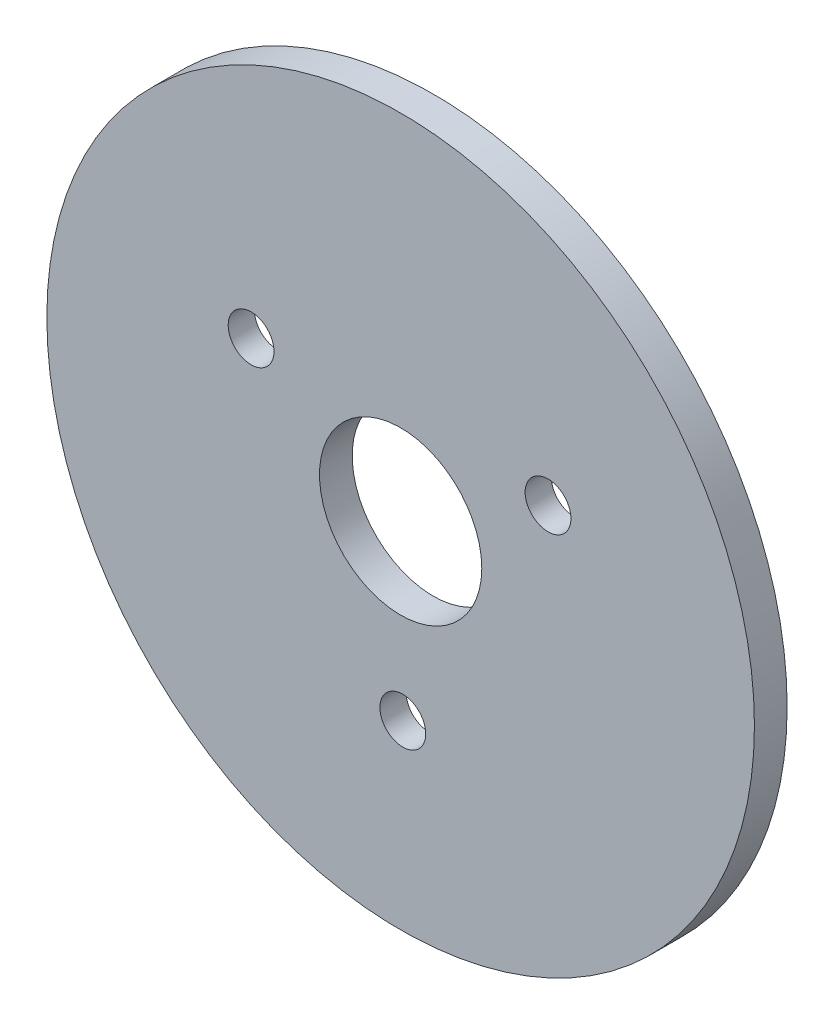
ISO-10303-21;
HEADER;
FILE_DESCRIPTION(('STEP AP214'),'2;1');
FILE_NAME('part.step','',(''),(''),'','','');
FILE_SCHEMA(('AUTOMOTIVE_DESIGN { 1 0 10303 214 1 1 1 1 }'));
ENDSEC;
DATA;
#1=APPLICATION_CONTEXT('core data for automotive mechanical design processes');
#2=APPLICATION_PROTOCOL_DEFINITION('international standard','automotive_design',2000,#1);
#3=PRODUCT_CONTEXT('',#1,'mechanical');
#4=PRODUCT('Part','Part','',(#3));
#5=PRODUCT_RELATED_PRODUCT_CATEGORY('part','',(#4));
#6=PRODUCT_DEFINITION_FORMATION('','',#4);
#7=PRODUCT_DEFINITION_CONTEXT('part definition',#1,'design');
#8=PRODUCT_DEFINITION('design','',#6,#7);
#9=PRODUCT_DEFINITION_SHAPE('','',#8);
#10=(LENGTH_UNIT() NAMED_UNIT(*) SI_UNIT(.MILLI.,.METRE.));
#11=(NAMED_UNIT(*) PLANE_ANGLE_UNIT() SI_UNIT($,.RADIAN.));
#12=(NAMED_UNIT(*) SI_UNIT($,.STERADIAN.) SOLID_ANGLE_UNIT());
#13=UNCERTAINTY_MEASURE_WITH_UNIT(LENGTH_MEASURE(1.E-05),#10,'distance_accuracy_value','');
#14=(GEOMETRIC_REPRESENTATION_CONTEXT(3) GLOBAL_UNCERTAINTY_ASSIGNED_CONTEXT((#13)) GLOBAL_UNIT_ASSIGNED_CONTEXT((#10,
#11,#12)) REPRESENTATION_CONTEXT('',''));
#15=CARTESIAN_POINT('',(0.,0.,0.));
#16=DIRECTION('',(0.,0.,1.));
#17=DIRECTION('',(1.,0.,0.));
#18=AXIS2_PLACEMENT_3D('',#15,#16,#17);
#19=CARTESIAN_POINT('',(11.2604799051485,6.69280128752395,-14.75));
#20=DIRECTION('',(0.,0.,-1.));
#21=DIRECTION('',(-1.,0.,0.));
#22=AXIS2_PLACEMENT_3D('',#19,#20,#21);
#23=CYLINDRICAL_SURFACE('',#22,1.75);
#24=CARTESIAN_POINT('',(11.2604799051485,6.69280128752395,-14.75));
#25=DIRECTION('',(0.,0.,-1.));
#26=DIRECTION('',(-1.,0.,0.));
#27=AXIS2_PLACEMENT_3D('',#24,#25,#26);
#28=CIRCLE('',#27,1.75);
#29=CARTESIAN_POINT('',(9.51047990514846,6.69280128752395,-14.75));
#30=VERTEX_POINT('',#29);
#31=EDGE_CURVE('E64',#30,#30,#28,.T.);
#32=ORIENTED_EDGE('',*,*,#31,.F.);
#33=EDGE_LOOP('',(#32));
#34=FACE_BOUND('',#33,.T.);
#35=CARTESIAN_POINT('',(11.2604799051485,6.69280128752395,-16.75));
#36=DIRECTION('',(0.,0.,-1.));
#37=DIRECTION('',(-1.,0.,0.));
#38=AXIS2_PLACEMENT_3D('',#35,#36,#37);
#39=CIRCLE('',#38,1.75);
#40=CARTESIAN_POINT('',(9.51047990514846,6.69280128752395,-16.75));
#41=VERTEX_POINT('',#40);
#42=EDGE_CURVE('E83',#41,#41,#39,.T.);
#43=ORIENTED_EDGE('',*,*,#42,.T.);
#44=EDGE_LOOP('',(#43));
#45=FACE_BOUND('',#44,.T.);
#46=ADVANCED_FACE('F34',(#34,#45),#23,.F.);
#47=CARTESIAN_POINT('',(0.165895984902648,-13.0982623004247,-14.75));
#48=DIRECTION('',(0.,0.,-1.));
#49=DIRECTION('',(-1.,0.,0.));
#50=AXIS2_PLACEMENT_3D('',#47,#48,#49);
#51=CYLINDRICAL_SURFACE('',#50,1.75);
#52=CARTESIAN_POINT('',(0.165895984902648,-13.0982623004247,-14.75));
#53=DIRECTION('',(0.,0.,-1.));
#54=DIRECTION('',(-1.,0.,0.));
#55=AXIS2_PLACEMENT_3D('',#52,#53,#54);
#56=CIRCLE('',#55,1.75);
#57=CARTESIAN_POINT('',(-1.58410401509735,-13.0982623004247,-14.75));
#58=VERTEX_POINT('',#57);
#59=EDGE_CURVE('E67',#58,#58,#56,.T.);
#60=ORIENTED_EDGE('',*,*,#59,.F.);
#61=EDGE_LOOP('',(#60));
#62=FACE_BOUND('',#61,.T.);
#63=CARTESIAN_POINT('',(0.165895984902648,-13.0982623004247,-16.75));
#64=DIRECTION('',(0.,0.,-1.));
#65=DIRECTION('',(-1.,0.,0.));
#66=AXIS2_PLACEMENT_3D('',#63,#64,#65);
#67=CIRCLE('',#66,1.75);
#68=CARTESIAN_POINT('',(-1.58410401509735,-13.0982623004247,-16.75));
#69=VERTEX_POINT('',#68);
#70=EDGE_CURVE('E77',#69,#69,#67,.T.);
#71=ORIENTED_EDGE('',*,*,#70,.T.);
#72=EDGE_LOOP('',(#71));
#73=FACE_BOUND('',#72,.T.);
#74=ADVANCED_FACE('F109',(#62,#73),#51,.F.);
#75=CARTESIAN_POINT('',(-11.4263758900512,6.40546101290072,-14.75));
#76=DIRECTION('',(0.,0.,-1.));
#77=DIRECTION('',(-1.,0.,0.));
#78=AXIS2_PLACEMENT_3D('',#75,#76,#77);
#79=CYLINDRICAL_SURFACE('',#78,1.75);
#80=CARTESIAN_POINT('',(-11.4263758900512,6.40546101290072,-14.75));
#81=DIRECTION('',(0.,0.,-1.));
#82=DIRECTION('',(-1.,0.,0.));
#83=AXIS2_PLACEMENT_3D('',#80,#81,#82);
#84=CIRCLE('',#83,1.75);
#85=CARTESIAN_POINT('',(-13.1763758900512,6.40546101290072,-14.75));
#86=VERTEX_POINT('',#85);
#87=EDGE_CURVE('E63',#86,#86,#84,.T.);
#88=ORIENTED_EDGE('',*,*,#87,.F.);
#89=EDGE_LOOP('',(#88));
#90=FACE_BOUND('',#89,.T.);
#91=CARTESIAN_POINT('',(-11.4263758900512,6.40546101290072,-16.75));
#92=DIRECTION('',(0.,0.,-1.));
#93=DIRECTION('',(-1.,0.,0.));
#94=AXIS2_PLACEMENT_3D('',#91,#92,#93);
#95=CIRCLE('',#94,1.75);
#96=CARTESIAN_POINT('',(-13.1763758900512,6.40546101290072,-16.75));
#97=VERTEX_POINT('',#96);
#98=EDGE_CURVE('E76',#97,#97,#95,.T.);
#99=ORIENTED_EDGE('',*,*,#98,.T.);
#100=EDGE_LOOP('',(#99));
#101=FACE_BOUND('',#100,.T.);
#102=ADVANCED_FACE('F116',(#90,#101),#79,.F.);
#103=CARTESIAN_POINT('',(0.,0.,-7.25));
#104=DIRECTION('',(0.,0.,1.));
#105=DIRECTION('',(1.,0.,0.));
#106=AXIS2_PLACEMENT_3D('',#103,#104,#105);
#107=CYLINDRICAL_SURFACE('',#106,6.2);
#108=CARTESIAN_POINT('',(0.,0.,-17.25));
#109=DIRECTION('',(0.,0.,1.));
#110=DIRECTION('',(1.,0.,0.));
#111=AXIS2_PLACEMENT_3D('',#108,#109,#110);
#112=CIRCLE('',#111,6.2);
#113=CARTESIAN_POINT('',(6.2,0.,-17.25));
#114=VERTEX_POINT('',#113);
#115=EDGE_CURVE('E55',#114,#114,#112,.F.);
#116=CARTESIAN_POINT('',(0.,0.,-14.75));
#117=DIRECTION('',(0.,0.,1.));
#118=DIRECTION('',(1.,0.,0.));
#119=AXIS2_PLACEMENT_3D('',#116,#117,#118);
#120=CIRCLE('',#119,6.2);
#121=CARTESIAN_POINT('',(6.2,0.,-14.75));
#122=VERTEX_POINT('',#121);
#123=EDGE_CURVE('E60',#122,#122,#120,.F.);
#124=CARTESIAN_POINT('',(6.2,0.,-17.25));
#125=CARTESIAN_POINT('',(6.2,0.,-17.2239583333333));
#126=CARTESIAN_POINT('',(6.2,0.,-17.1979166666667));
#127=CARTESIAN_POINT('',(6.2,0.,-17.1458333333333));
#128=CARTESIAN_POINT('',(6.2,0.,-17.1197916666667));
#129=CARTESIAN_POINT('',(6.2,0.,-17.0677083333333));
#130=CARTESIAN_POINT('',(6.2,0.,-17.0416666666667));
#131=CARTESIAN_POINT('',(6.2,0.,-16.9895833333333));
#132=CARTESIAN_POINT('',(6.2,0.,-16.9635416666667));
#133=CARTESIAN_POINT('',(6.2,0.,-16.9114583333333));
#134=CARTESIAN_POINT('',(6.2,0.,-16.8854166666667));
#135=CARTESIAN_POINT('',(6.2,0.,-16.8333333333333));
#136=CARTESIAN_POINT('',(6.2,0.,-16.8072916666667));
#137=CARTESIAN_POINT('',(6.2,0.,-16.7552083333333));
#138=CARTESIAN_POINT('',(6.2,0.,-16.7291666666667));
#139=CARTESIAN_POINT('',(6.2,0.,-16.6770833333333));
#140=CARTESIAN_POINT('',(6.2,0.,-16.6510416666667));
#141=CARTESIAN_POINT('',(6.2,0.,-16.5989583333333));
#142=CARTESIAN_POINT('',(6.2,0.,-16.5729166666667));
#143=CARTESIAN_POINT('',(6.2,0.,-16.5208333333333));
#144=CARTESIAN_POINT('',(6.2,0.,-16.4947916666667));
#145=CARTESIAN_POINT('',(6.2,0.,-16.4427083333333));
#146=CARTESIAN_POINT('',(6.2,0.,-16.4166666666667));
#147=CARTESIAN_POINT('',(6.2,0.,-16.3645833333333));
#148=CARTESIAN_POINT('',(6.2,0.,-16.3385416666667));
#149=CARTESIAN_POINT('',(6.2,0.,-16.2864583333333));
#150=CARTESIAN_POINT('',(6.2,0.,-16.2604166666667));
#151=CARTESIAN_POINT('',(6.2,0.,-16.2083333333333));
#152=CARTESIAN_POINT('',(6.2,0.,-16.1822916666667));
#153=CARTESIAN_POINT('',(6.2,0.,-16.1302083333333));
#154=CARTESIAN_POINT('',(6.2,0.,-16.1041666666667));
#155=CARTESIAN_POINT('',(6.2,0.,-16.0520833333333));
#156=CARTESIAN_POINT('',(6.2,0.,-16.0260416666667));
#157=CARTESIAN_POINT('',(6.2,0.,-15.9739583333333));
#158=CARTESIAN_POINT('',(6.2,0.,-15.9479166666667));
#159=CARTESIAN_POINT('',(6.2,0.,-15.8958333333333));
#160=CARTESIAN_POINT('',(6.2,0.,-15.8697916666667));
#161=CARTESIAN_POINT('',(6.2,0.,-15.8177083333333));
#162=CARTESIAN_POINT('',(6.2,0.,-15.7916666666667));
#163=CARTESIAN_POINT('',(6.2,0.,-15.7395833333333));
#164=CARTESIAN_POINT('',(6.2,0.,-15.7135416666667));
#165=CARTESIAN_POINT('',(6.2,0.,-15.6614583333333));
#166=CARTESIAN_POINT('',(6.2,0.,-15.6354166666667));
#167=CARTESIAN_POINT('',(6.2,0.,-15.5833333333333));
#168=CARTESIAN_POINT('',(6.2,0.,-15.5572916666667));
#169=CARTESIAN_POINT('',(6.2,0.,-15.5052083333333));
#170=CARTESIAN_POINT('',(6.2,0.,-15.4791666666667));
#171=CARTESIAN_POINT('',(6.2,0.,-15.4270833333333));
#172=CARTESIAN_POINT('',(6.2,0.,-15.4010416666667));
#173=CARTESIAN_POINT('',(6.2,0.,-15.3489583333333));
#174=CARTESIAN_POINT('',(6.2,0.,-15.3229166666667));
#175=CARTESIAN_POINT('',(6.2,0.,-15.2708333333333));
#176=CARTESIAN_POINT('',(6.2,0.,-15.2447916666667));
#177=CARTESIAN_POINT('',(6.2,0.,-15.1927083333333));
#178=CARTESIAN_POINT('',(6.2,0.,-15.1666666666667));
#179=CARTESIAN_POINT('',(6.2,0.,-15.1145833333333));
#180=CARTESIAN_POINT('',(6.2,0.,-15.0885416666667));
#181=CARTESIAN_POINT('',(6.2,0.,-15.0364583333333));
#182=CARTESIAN_POINT('',(6.2,0.,-15.0104166666667));
#183=CARTESIAN_POINT('',(6.2,0.,-14.9583333333333));
#184=CARTESIAN_POINT('',(6.2,0.,-14.9322916666667));
#185=CARTESIAN_POINT('',(6.2,0.,-14.8802083333333));
#186=CARTESIAN_POINT('',(6.2,0.,-14.8541666666667));
#187=CARTESIAN_POINT('',(6.2,0.,-14.8020833333333));
#188=CARTESIAN_POINT('',(6.2,0.,-14.7760416666667));
#189=CARTESIAN_POINT('',(6.2,0.,-14.75));
#190=B_SPLINE_CURVE_WITH_KNOTS('',3,(#124,#125,#126,#127,#128,#129,#130,#131,#132,#133,#134,
#135,#136,#137,#138,#139,#140,#141,#142,#143,#144,#145,#146,#147,#148,#149,#150,#151,#152,#153,
#154,#155,#156,#157,#158,#159,#160,#161,#162,#163,#164,#165,#166,#167,#168,#169,#170,#171,#172,
#173,#174,#175,#176,#177,#178,#179,#180,#181,#182,#183,#184,#185,#186,#187,#188,#189),
.UNSPECIFIED.,.F.,.F.,(4,2,2,2,2,2,2,2,2,2,2,2,2,2,2,2,2,2,2,2,2,2,2,2,2,2,2,2,2,2,2,2,4),(0.,
0.0781250000000018,0.15625,0.234375000000002,0.3125,0.390625000000002,0.46875,0.546875000000002,
0.625000000000001,0.703125000000002,0.781250000000001,0.859375000000002,0.937500000000001,
1.015625,1.09375,1.171875,1.25,1.328125,1.40625,1.484375,1.5625,1.640625,1.71875,1.796875,1.875,
1.953125,2.03125,2.109375,2.1875,2.265625,2.34375,2.421875,2.5),.UNSPECIFIED.);
#191=EDGE_CURVE('BSEAM130',#114,#122,#190,.T.);
#192=ORIENTED_EDGE('',*,*,#115,.T.);
#193=ORIENTED_EDGE('',*,*,#123,.F.);
#194=ORIENTED_EDGE('',*,*,#191,.T.);
#195=ORIENTED_EDGE('',*,*,#191,.F.);
#196=EDGE_LOOP('',(#192,#194,#193,#195));
#197=FACE_BOUND('',#196,.T.);
#198=ADVANCED_FACE('F130',(#197),#107,.F.);
#199=CARTESIAN_POINT('',(0.,0.,-14.75));
#200=DIRECTION('',(0.,0.,-1.));
#201=DIRECTION('',(-1.,0.,0.));
#202=AXIS2_PLACEMENT_3D('',#199,#200,#201);
#203=PLANE('',#202);
#204=ORIENTED_EDGE('',*,*,#87,.T.);
#205=EDGE_LOOP('',(#204));
#206=FACE_BOUND('',#205,.T.);
#207=ORIENTED_EDGE('',*,*,#59,.T.);
#208=EDGE_LOOP('',(#207));
#209=FACE_BOUND('',#208,.T.);
#210=ORIENTED_EDGE('',*,*,#31,.T.);
#211=EDGE_LOOP('',(#210));
#212=FACE_BOUND('',#211,.T.);
#213=CARTESIAN_POINT('',(0.,0.,-14.75));
#214=DIRECTION('',(0.,0.,-1.));
#215=DIRECTION('',(-1.,0.,0.));
#216=AXIS2_PLACEMENT_3D('',#213,#214,#215);
#217=CIRCLE('',#216,27.0316477779777);
#218=CARTESIAN_POINT('',(-27.0316477779777,0.,-14.75));
#219=VERTEX_POINT('',#218);
#220=EDGE_CURVE('E52',#219,#219,#217,.T.);
#221=ORIENTED_EDGE('',*,*,#220,.F.);
#222=EDGE_LOOP('',(#221));
#223=FACE_BOUND('',#222,.T.);
#224=ORIENTED_EDGE('',*,*,#123,.T.);
#225=EDGE_LOOP('',(#224));
#226=FACE_BOUND('',#225,.T.);
#227=ADVANCED_FACE('F127',(#206,#209,#212,#223,#226),#203,.F.);
#228=CARTESIAN_POINT('',(0.,0.,-17.25));
#229=DIRECTION('',(0.,0.,1.));
#230=DIRECTION('',(1.,0.,0.));
#231=AXIS2_PLACEMENT_3D('',#228,#229,#230);
#232=CYLINDRICAL_SURFACE('',#231,27.0316477779777);
#233=CARTESIAN_POINT('',(0.,0.,-17.25));
#234=DIRECTION('',(0.,0.,-1.));
#235=DIRECTION('',(-1.,0.,0.));
#236=AXIS2_PLACEMENT_3D('',#233,#234,#235);
#237=CIRCLE('',#236,27.0316477779777);
#238=CARTESIAN_POINT('',(-27.0316477779777,0.,-17.25));
#239=VERTEX_POINT('',#238);
#240=EDGE_CURVE('E49',#239,#239,#237,.T.);
#241=ORIENTED_EDGE('',*,*,#240,.F.);
#242=EDGE_LOOP('',(#241));
#243=FACE_BOUND('',#242,.T.);
#244=ORIENTED_EDGE('',*,*,#220,.T.);
#245=EDGE_LOOP('',(#244));
#246=FACE_BOUND('',#245,.T.);
#247=ADVANCED_FACE('F126',(#243,#246),#232,.T.);
#248=CARTESIAN_POINT('',(0.,0.,-17.25));
#249=DIRECTION('',(0.,0.,-1.));
#250=DIRECTION('',(-1.,0.,0.));
#251=AXIS2_PLACEMENT_3D('',#248,#249,#250);
#252=PLANE('',#251);
#253=CARTESIAN_POINT('',(0.165895984902648,-13.0982623004247,-17.25));
#254=DIRECTION('',(0.,0.,-1.));
#255=DIRECTION('',(-1.,0.,0.));
#256=AXIS2_PLACEMENT_3D('',#253,#254,#255);
#257=CIRCLE('',#256,5.5);
#258=CARTESIAN_POINT('',(-5.33410401509735,-13.0982623004247,-17.25));
#259=VERTEX_POINT('',#258);
#260=EDGE_CURVE('E11',#259,#259,#257,.F.);
#261=ORIENTED_EDGE('',*,*,#260,.T.);
#262=EDGE_LOOP('',(#261));
#263=FACE_BOUND('',#262,.T.);
#264=CARTESIAN_POINT('',(-11.4263758900512,6.40546101290072,-17.25));
#265=DIRECTION('',(0.,0.,-1.));
#266=DIRECTION('',(-1.,0.,0.));
#267=AXIS2_PLACEMENT_3D('',#264,#265,#266);
#268=CIRCLE('',#267,5.5);
#269=CARTESIAN_POINT('',(-16.9263758900512,6.40546101290072,-17.25));
#270=VERTEX_POINT('',#269);
#271=EDGE_CURVE('E41',#270,#270,#268,.F.);
#272=ORIENTED_EDGE('',*,*,#271,.T.);
#273=EDGE_LOOP('',(#272));
#274=FACE_BOUND('',#273,.T.);
#275=CARTESIAN_POINT('',(11.2604799051485,6.69280128752395,-17.25));
#276=DIRECTION('',(0.,0.,-1.));
#277=DIRECTION('',(-1.,0.,0.));
#278=AXIS2_PLACEMENT_3D('',#275,#276,#277);
#279=CIRCLE('',#278,5.5);
#280=CARTESIAN_POINT('',(5.76047990514846,6.69280128752395,-17.25));
#281=VERTEX_POINT('',#280);
#282=EDGE_CURVE('E45',#281,#281,#279,.F.);
#283=ORIENTED_EDGE('',*,*,#282,.T.);
#284=EDGE_LOOP('',(#283));
#285=FACE_BOUND('',#284,.T.);
#286=ORIENTED_EDGE('',*,*,#115,.F.);
#287=EDGE_LOOP('',(#286));
#288=FACE_BOUND('',#287,.T.);
#289=ORIENTED_EDGE('',*,*,#240,.T.);
#290=EDGE_LOOP('',(#289));
#291=FACE_BOUND('',#290,.T.);
#292=ADVANCED_FACE('F122',(#263,#274,#285,#288,#291),#252,.T.);
#293=CARTESIAN_POINT('',(-11.4263758900512,6.40546101290072,-16.75));
#294=DIRECTION('',(0.,0.,-1.));
#295=DIRECTION('',(-1.,0.,0.));
#296=AXIS2_PLACEMENT_3D('',#293,#294,#295);
#297=PLANE('',#296);
#298=ORIENTED_EDGE('',*,*,#98,.F.);
#299=EDGE_LOOP('',(#298));
#300=FACE_BOUND('',#299,.T.);
#301=CARTESIAN_POINT('',(-11.4263758900512,6.40546101290072,-16.75));
#302=DIRECTION('',(0.,0.,-1.));
#303=DIRECTION('',(-1.,0.,0.));
#304=AXIS2_PLACEMENT_3D('',#301,#302,#303);
#305=CIRCLE('',#304,5.);
#306=CARTESIAN_POINT('',(-16.4263758900512,6.40546101290072,-16.75));
#307=VERTEX_POINT('',#306);
#308=EDGE_CURVE('E80',#307,#307,#305,.T.);
#309=ORIENTED_EDGE('',*,*,#308,.T.);
#310=EDGE_LOOP('',(#309));
#311=FACE_BOUND('',#310,.T.);
#312=ADVANCED_FACE('F125',(#300,#311),#297,.T.);
#313=CARTESIAN_POINT('',(0.165895984902648,-13.0982623004247,-16.75));
#314=DIRECTION('',(0.,0.,-1.));
#315=DIRECTION('',(-1.,0.,0.));
#316=AXIS2_PLACEMENT_3D('',#313,#314,#315);
#317=PLANE('',#316);
#318=ORIENTED_EDGE('',*,*,#70,.F.);
#319=EDGE_LOOP('',(#318));
#320=FACE_BOUND('',#319,.T.);
#321=CARTESIAN_POINT('',(0.165895984902648,-13.0982623004247,-16.75));
#322=DIRECTION('',(0.,0.,-1.));
#323=DIRECTION('',(-1.,0.,0.));
#324=AXIS2_PLACEMENT_3D('',#321,#322,#323);
#325=CIRCLE('',#324,5.);
#326=CARTESIAN_POINT('',(-4.83410401509735,-13.0982623004247,-16.75));
#327=VERTEX_POINT('',#326);
#328=EDGE_CURVE('E73',#327,#327,#325,.T.);
#329=ORIENTED_EDGE('',*,*,#328,.T.);
#330=EDGE_LOOP('',(#329));
#331=FACE_BOUND('',#330,.T.);
#332=ADVANCED_FACE('F96',(#320,#331),#317,.T.);
#333=CARTESIAN_POINT('',(11.2604799051485,6.69280128752395,-16.75));
#334=DIRECTION('',(0.,0.,-1.));
#335=DIRECTION('',(-1.,0.,0.));
#336=AXIS2_PLACEMENT_3D('',#333,#334,#335);
#337=PLANE('',#336);
#338=ORIENTED_EDGE('',*,*,#42,.F.);
#339=EDGE_LOOP('',(#338));
#340=FACE_BOUND('',#339,.T.);
#341=CARTESIAN_POINT('',(11.2604799051485,6.69280128752395,-16.75));
#342=DIRECTION('',(0.,0.,-1.));
#343=DIRECTION('',(-1.,0.,0.));
#344=AXIS2_PLACEMENT_3D('',#341,#342,#343);
#345=CIRCLE('',#344,5.);
#346=CARTESIAN_POINT('',(6.26047990514846,6.69280128752395,-16.75));
#347=VERTEX_POINT('',#346);
#348=EDGE_CURVE('E68',#347,#347,#345,.T.);
#349=ORIENTED_EDGE('',*,*,#348,.T.);
#350=EDGE_LOOP('',(#349));
#351=FACE_BOUND('',#350,.T.);
#352=ADVANCED_FACE('F92',(#340,#351),#337,.T.);
#353=CARTESIAN_POINT('',(0.165895984902648,-13.0982623004247,-16.75));
#354=DIRECTION('',(0.,0.,-1.));
#355=DIRECTION('',(-1.,0.,0.));
#356=AXIS2_PLACEMENT_3D('',#353,#354,#355);
#357=TOROIDAL_SURFACE('',#356,5.5,0.5);
#358=ORIENTED_EDGE('',*,*,#260,.F.);
#359=EDGE_LOOP('',(#358));
#360=FACE_BOUND('',#359,.T.);
#361=ORIENTED_EDGE('',*,*,#328,.F.);
#362=EDGE_LOOP('',(#361));
#363=FACE_BOUND('',#362,.T.);
#364=ADVANCED_FACE('F95',(#360,#363),#357,.T.);
#365=CARTESIAN_POINT('',(-11.4263758900512,6.40546101290072,-16.75));
#366=DIRECTION('',(0.,0.,-1.));
#367=DIRECTION('',(-1.,0.,0.));
#368=AXIS2_PLACEMENT_3D('',#365,#366,#367);
#369=TOROIDAL_SURFACE('',#368,5.5,0.5);
#370=ORIENTED_EDGE('',*,*,#271,.F.);
#371=EDGE_LOOP('',(#370));
#372=FACE_BOUND('',#371,.T.);
#373=ORIENTED_EDGE('',*,*,#308,.F.);
#374=EDGE_LOOP('',(#373));
#375=FACE_BOUND('',#374,.T.);
#376=ADVANCED_FACE('F101',(#372,#375),#369,.T.);
#377=CARTESIAN_POINT('',(11.2604799051485,6.69280128752395,-16.75));
#378=DIRECTION('',(0.,0.,-1.));
#379=DIRECTION('',(-1.,0.,0.));
#380=AXIS2_PLACEMENT_3D('',#377,#378,#379);
#381=TOROIDAL_SURFACE('',#380,5.5,0.5);
#382=ORIENTED_EDGE('',*,*,#282,.F.);
#383=EDGE_LOOP('',(#382));
#384=FACE_BOUND('',#383,.T.);
#385=ORIENTED_EDGE('',*,*,#348,.F.);
#386=EDGE_LOOP('',(#385));
#387=FACE_BOUND('',#386,.T.);
#388=ADVANCED_FACE('F36',(#384,#387),#381,.T.);
#389=CLOSED_SHELL('',(#46,#74,#102,#198,#227,#247,#292,#312,#332,#352,#364,#376,#388));
#390=MANIFOLD_SOLID_BREP('B2',#389);
#391=ADVANCED_BREP_SHAPE_REPRESENTATION('',(#18,#390),#14);
#392=SHAPE_DEFINITION_REPRESENTATION(#9,#391);
ENDSEC;
END-ISO-10303-21;
